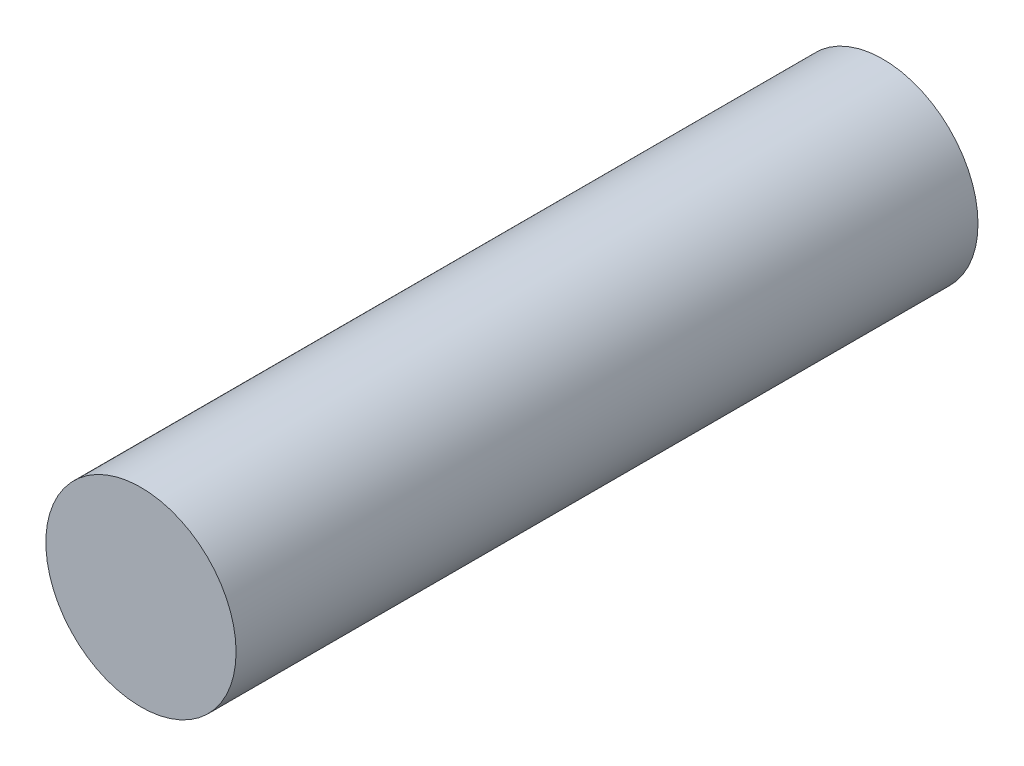
ISO-10303-21;
HEADER;
FILE_DESCRIPTION(('STEP AP214'),'2;1');
FILE_NAME('part.step','',(''),(''),'','','');
FILE_SCHEMA(('AUTOMOTIVE_DESIGN { 1 0 10303 214 1 1 1 1 }'));
ENDSEC;
DATA;
#1=APPLICATION_CONTEXT('core data for automotive mechanical design processes');
#2=APPLICATION_PROTOCOL_DEFINITION('international standard','automotive_design',2000,#1);
#3=PRODUCT_CONTEXT('',#1,'mechanical');
#4=PRODUCT('Part','Part','',(#3));
#5=PRODUCT_RELATED_PRODUCT_CATEGORY('part','',(#4));
#6=PRODUCT_DEFINITION_FORMATION('','',#4);
#7=PRODUCT_DEFINITION_CONTEXT('part definition',#1,'design');
#8=PRODUCT_DEFINITION('design','',#6,#7);
#9=PRODUCT_DEFINITION_SHAPE('','',#8);
#10=(LENGTH_UNIT() NAMED_UNIT(*) SI_UNIT(.MILLI.,.METRE.));
#11=(NAMED_UNIT(*) PLANE_ANGLE_UNIT() SI_UNIT($,.RADIAN.));
#12=(NAMED_UNIT(*) SI_UNIT($,.STERADIAN.) SOLID_ANGLE_UNIT());
#13=UNCERTAINTY_MEASURE_WITH_UNIT(LENGTH_MEASURE(1.E-05),#10,'distance_accuracy_value','');
#14=(GEOMETRIC_REPRESENTATION_CONTEXT(3) GLOBAL_UNCERTAINTY_ASSIGNED_CONTEXT((#13)) GLOBAL_UNIT_ASSIGNED_CONTEXT((#10,
#11,#12)) REPRESENTATION_CONTEXT('',''));
#15=CARTESIAN_POINT('',(0.,0.,0.));
#16=DIRECTION('',(0.,0.,1.));
#17=DIRECTION('',(1.,0.,0.));
#18=AXIS2_PLACEMENT_3D('',#15,#16,#17);
#19=CARTESIAN_POINT('',(0.,0.,39.));
#20=DIRECTION('',(0.,0.,-1.));
#21=DIRECTION('',(-1.,0.,0.));
#22=AXIS2_PLACEMENT_3D('',#19,#20,#21);
#23=CYLINDRICAL_SURFACE('',#22,10.);
#24=CARTESIAN_POINT('',(0.,0.,39.));
#25=DIRECTION('',(0.,0.,1.));
#26=DIRECTION('',(1.,0.,0.));
#27=AXIS2_PLACEMENT_3D('',#24,#25,#26);
#28=CIRCLE('',#27,10.);
#29=CARTESIAN_POINT('',(10.,0.,39.));
#30=VERTEX_POINT('',#29);
#31=EDGE_CURVE('E10',#30,#30,#28,.T.);
#32=ORIENTED_EDGE('',*,*,#31,.F.);
#33=EDGE_LOOP('',(#32));
#34=FACE_BOUND('',#33,.T.);
#35=CARTESIAN_POINT('',(0.,0.,-39.));
#36=DIRECTION('',(0.,0.,1.));
#37=DIRECTION('',(1.,0.,0.));
#38=AXIS2_PLACEMENT_3D('',#35,#36,#37);
#39=CIRCLE('',#38,10.);
#40=CARTESIAN_POINT('',(10.,0.,-39.));
#41=VERTEX_POINT('',#40);
#42=EDGE_CURVE('E37',#41,#41,#39,.T.);
#43=ORIENTED_EDGE('',*,*,#42,.T.);
#44=EDGE_LOOP('',(#43));
#45=FACE_BOUND('',#44,.T.);
#46=ADVANCED_FACE('F34',(#34,#45),#23,.T.);
#47=CARTESIAN_POINT('',(0.,0.,39.));
#48=DIRECTION('',(0.,0.,1.));
#49=DIRECTION('',(1.,0.,0.));
#50=AXIS2_PLACEMENT_3D('',#47,#48,#49);
#51=PLANE('',#50);
#52=ORIENTED_EDGE('',*,*,#31,.T.);
#53=EDGE_LOOP('',(#52));
#54=FACE_BOUND('',#53,.T.);
#55=ADVANCED_FACE('F49',(#54),#51,.T.);
#56=CARTESIAN_POINT('',(0.,0.,-39.));
#57=DIRECTION('',(0.,0.,1.));
#58=DIRECTION('',(1.,0.,0.));
#59=AXIS2_PLACEMENT_3D('',#56,#57,#58);
#60=PLANE('',#59);
#61=ORIENTED_EDGE('',*,*,#42,.F.);
#62=EDGE_LOOP('',(#61));
#63=FACE_BOUND('',#62,.T.);
#64=ADVANCED_FACE('F47',(#63),#60,.F.);
#65=CLOSED_SHELL('',(#46,#55,#64));
#66=MANIFOLD_SOLID_BREP('B2',#65);
#67=ADVANCED_BREP_SHAPE_REPRESENTATION('',(#18,#66),#14);
#68=SHAPE_DEFINITION_REPRESENTATION(#9,#67);
ENDSEC;
END-ISO-10303-21;
